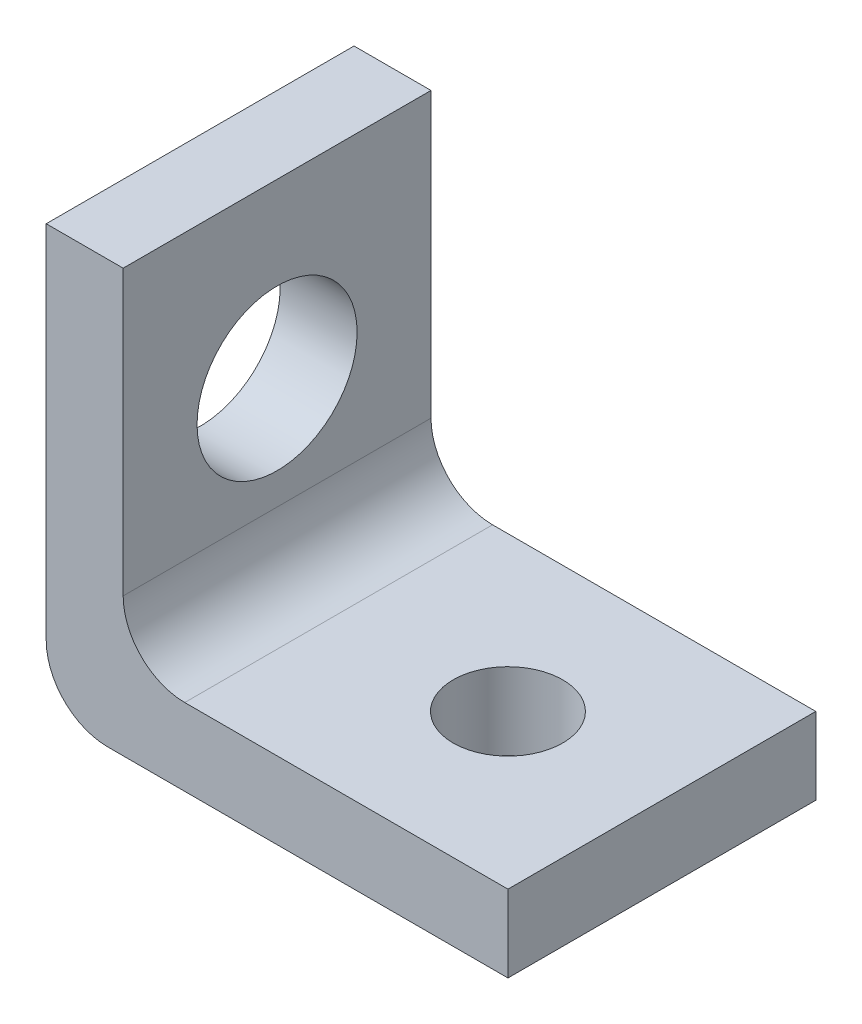
ISO-10303-21;
HEADER;
FILE_DESCRIPTION(('STEP AP214'),'2;1');
FILE_NAME('part.step','',(''),(''),'','','');
FILE_SCHEMA(('AUTOMOTIVE_DESIGN { 1 0 10303 214 1 1 1 1 }'));
ENDSEC;
DATA;
#1=APPLICATION_CONTEXT('core data for automotive mechanical design processes');
#2=APPLICATION_PROTOCOL_DEFINITION('international standard','automotive_design',2000,#1);
#3=PRODUCT_CONTEXT('',#1,'mechanical');
#4=PRODUCT('Part','Part','',(#3));
#5=PRODUCT_RELATED_PRODUCT_CATEGORY('part','',(#4));
#6=PRODUCT_DEFINITION_FORMATION('','',#4);
#7=PRODUCT_DEFINITION_CONTEXT('part definition',#1,'design');
#8=PRODUCT_DEFINITION('design','',#6,#7);
#9=PRODUCT_DEFINITION_SHAPE('','',#8);
#10=(LENGTH_UNIT() NAMED_UNIT(*) SI_UNIT(.MILLI.,.METRE.));
#11=(NAMED_UNIT(*) PLANE_ANGLE_UNIT() SI_UNIT($,.RADIAN.));
#12=(NAMED_UNIT(*) SI_UNIT($,.STERADIAN.) SOLID_ANGLE_UNIT());
#13=UNCERTAINTY_MEASURE_WITH_UNIT(LENGTH_MEASURE(1.E-05),#10,'distance_accuracy_value','');
#14=(GEOMETRIC_REPRESENTATION_CONTEXT(3) GLOBAL_UNCERTAINTY_ASSIGNED_CONTEXT((#13)) GLOBAL_UNIT_ASSIGNED_CONTEXT((#10,
#11,#12)) REPRESENTATION_CONTEXT('',''));
#15=CARTESIAN_POINT('',(0.,0.,0.));
#16=DIRECTION('',(0.,0.,1.));
#17=DIRECTION('',(1.,0.,0.));
#18=AXIS2_PLACEMENT_3D('',#15,#16,#17);
#19=CARTESIAN_POINT('',(0.,7.1247,6.35));
#20=DIRECTION('',(0.,-1.,0.));
#21=DIRECTION('',(1.,0.,0.));
#22=AXIS2_PLACEMENT_3D('',#19,#20,#21);
#23=PLANE('',#22);
#24=DIRECTION('',(-1.,0.,0.));
#25=VECTOR('',#24,1.);
#26=CARTESIAN_POINT('',(0.,7.1247,0.));
#27=LINE('',#26,#25);
#28=CARTESIAN_POINT('',(0.,7.1247,0.));
#29=VERTEX_POINT('',#28);
#30=CARTESIAN_POINT('',(-1.5875,7.1247,0.));
#31=VERTEX_POINT('',#30);
#32=EDGE_CURVE('E130',#29,#31,#27,.T.);
#33=ORIENTED_EDGE('',*,*,#32,.T.);
#34=DIRECTION('',(0.,0.,-1.));
#35=VECTOR('',#34,1.);
#36=CARTESIAN_POINT('',(-1.5875,7.1247,6.35));
#37=LINE('',#36,#35);
#38=CARTESIAN_POINT('',(-1.5875,7.1247,6.35));
#39=VERTEX_POINT('',#38);
#40=EDGE_CURVE('E11',#39,#31,#37,.T.);
#41=ORIENTED_EDGE('',*,*,#40,.F.);
#42=DIRECTION('',(-1.,0.,0.));
#43=VECTOR('',#42,1.);
#44=CARTESIAN_POINT('',(0.,7.1247,6.35));
#45=LINE('',#44,#43);
#46=CARTESIAN_POINT('',(0.,7.1247,6.35));
#47=VERTEX_POINT('',#46);
#48=EDGE_CURVE('E145',#47,#39,#45,.T.);
#49=ORIENTED_EDGE('',*,*,#48,.F.);
#50=DIRECTION('',(0.,0.,-1.));
#51=VECTOR('',#50,1.);
#52=CARTESIAN_POINT('',(0.,7.1247,6.35));
#53=LINE('',#52,#51);
#54=EDGE_CURVE('E126',#47,#29,#53,.T.);
#55=ORIENTED_EDGE('',*,*,#54,.T.);
#56=EDGE_LOOP('',(#33,#41,#49,#55));
#57=FACE_BOUND('',#56,.T.);
#58=ADVANCED_FACE('F34',(#57),#23,.F.);
#59=CARTESIAN_POINT('',(-1.5875,7.1247,6.35));
#60=DIRECTION('',(1.,0.,0.));
#61=DIRECTION('',(0.,1.,0.));
#62=AXIS2_PLACEMENT_3D('',#59,#60,#61);
#63=PLANE('',#62);
#64=CARTESIAN_POINT('',(-1.5875,3.5687,3.175));
#65=DIRECTION('',(1.,0.,0.));
#66=DIRECTION('',(0.,1.,0.));
#67=AXIS2_PLACEMENT_3D('',#64,#65,#66);
#68=CIRCLE('',#67,1.65099999999999);
#69=CARTESIAN_POINT('',(-1.5875,5.21969999999999,3.175));
#70=VERTEX_POINT('',#69);
#71=EDGE_CURVE('E134',#70,#70,#68,.T.);
#72=ORIENTED_EDGE('',*,*,#71,.T.);
#73=EDGE_LOOP('',(#72));
#74=FACE_BOUND('',#73,.T.);
#75=DIRECTION('',(0.,-1.,0.));
#76=VECTOR('',#75,1.);
#77=CARTESIAN_POINT('',(-1.5875,7.1247,0.));
#78=LINE('',#77,#76);
#79=CARTESIAN_POINT('',(-1.5875,-0.317499999999986,0.));
#80=VERTEX_POINT('',#79);
#81=EDGE_CURVE('E133',#31,#80,#78,.T.);
#82=ORIENTED_EDGE('',*,*,#81,.T.);
#83=DIRECTION('',(0.,0.,-1.));
#84=VECTOR('',#83,1.);
#85=CARTESIAN_POINT('',(-1.5875,-0.317499999999986,6.35));
#86=LINE('',#85,#84);
#87=CARTESIAN_POINT('',(-1.5875,-0.317499999999986,6.35));
#88=VERTEX_POINT('',#87);
#89=EDGE_CURVE('E42',#88,#80,#86,.T.);
#90=ORIENTED_EDGE('',*,*,#89,.F.);
#91=DIRECTION('',(0.,-1.,0.));
#92=VECTOR('',#91,1.);
#93=CARTESIAN_POINT('',(-1.5875,7.1247,6.35));
#94=LINE('',#93,#92);
#95=EDGE_CURVE('E93',#39,#88,#94,.T.);
#96=ORIENTED_EDGE('',*,*,#95,.F.);
#97=ORIENTED_EDGE('',*,*,#40,.T.);
#98=EDGE_LOOP('',(#82,#90,#96,#97));
#99=FACE_BOUND('',#98,.T.);
#100=ADVANCED_FACE('F202',(#74,#99),#63,.F.);
#101=CARTESIAN_POINT('',(-0.3175,-0.317499999999996,6.35));
#102=DIRECTION('',(0.,0.,-1.));
#103=DIRECTION('',(-1.,0.,0.));
#104=AXIS2_PLACEMENT_3D('',#101,#102,#103);
#105=CYLINDRICAL_SURFACE('',#104,1.27);
#106=CARTESIAN_POINT('',(-0.3175,-0.317499999999996,0.));
#107=DIRECTION('',(0.,0.,1.));
#108=DIRECTION('',(1.,0.,0.));
#109=AXIS2_PLACEMENT_3D('',#106,#107,#108);
#110=CIRCLE('',#109,1.27);
#111=CARTESIAN_POINT('',(-0.317499999999991,-1.5875,0.));
#112=VERTEX_POINT('',#111);
#113=EDGE_CURVE('E136',#80,#112,#110,.T.);
#114=ORIENTED_EDGE('',*,*,#113,.T.);
#115=DIRECTION('',(0.,0.,-1.));
#116=VECTOR('',#115,1.);
#117=CARTESIAN_POINT('',(-0.317499999999991,-1.5875,6.35));
#118=LINE('',#117,#116);
#119=CARTESIAN_POINT('',(-0.317499999999991,-1.5875,6.35));
#120=VERTEX_POINT('',#119);
#121=EDGE_CURVE('E152',#120,#112,#118,.T.);
#122=ORIENTED_EDGE('',*,*,#121,.F.);
#123=CARTESIAN_POINT('',(-0.3175,-0.317499999999996,6.35));
#124=DIRECTION('',(0.,0.,1.));
#125=DIRECTION('',(1.,0.,0.));
#126=AXIS2_PLACEMENT_3D('',#123,#124,#125);
#127=CIRCLE('',#126,1.27);
#128=EDGE_CURVE('E160',#88,#120,#127,.T.);
#129=ORIENTED_EDGE('',*,*,#128,.F.);
#130=ORIENTED_EDGE('',*,*,#89,.T.);
#131=EDGE_LOOP('',(#114,#122,#129,#130));
#132=FACE_BOUND('',#131,.T.);
#133=ADVANCED_FACE('F158',(#132),#105,.T.);
#134=CARTESIAN_POINT('',(-0.317499999999991,-1.5875,6.35));
#135=DIRECTION('',(0.,1.,0.));
#136=DIRECTION('',(-1.,0.,0.));
#137=AXIS2_PLACEMENT_3D('',#134,#135,#136);
#138=PLANE('',#137);
#139=CARTESIAN_POINT('',(4.7625,-1.5875,3.175));
#140=DIRECTION('',(0.,1.,0.));
#141=DIRECTION('',(0.,0.,1.));
#142=AXIS2_PLACEMENT_3D('',#139,#140,#141);
#143=CIRCLE('',#142,1.1303);
#144=CARTESIAN_POINT('',(4.7625,-1.5875,4.3053));
#145=VERTEX_POINT('',#144);
#146=EDGE_CURVE('E183',#145,#145,#143,.T.);
#147=ORIENTED_EDGE('',*,*,#146,.T.);
#148=EDGE_LOOP('',(#147));
#149=FACE_BOUND('',#148,.T.);
#150=DIRECTION('',(1.,0.,0.));
#151=VECTOR('',#150,1.);
#152=CARTESIAN_POINT('',(-0.317499999999991,-1.5875,0.));
#153=LINE('',#152,#151);
#154=CARTESIAN_POINT('',(7.9375,-1.5875,0.));
#155=VERTEX_POINT('',#154);
#156=EDGE_CURVE('E138',#112,#155,#153,.T.);
#157=ORIENTED_EDGE('',*,*,#156,.T.);
#158=DIRECTION('',(0.,0.,-1.));
#159=VECTOR('',#158,1.);
#160=CARTESIAN_POINT('',(7.9375,-1.5875,6.35));
#161=LINE('',#160,#159);
#162=CARTESIAN_POINT('',(7.9375,-1.5875,6.35));
#163=VERTEX_POINT('',#162);
#164=EDGE_CURVE('E149',#163,#155,#161,.T.);
#165=ORIENTED_EDGE('',*,*,#164,.F.);
#166=DIRECTION('',(1.,0.,0.));
#167=VECTOR('',#166,1.);
#168=CARTESIAN_POINT('',(-0.317499999999991,-1.5875,6.35));
#169=LINE('',#168,#167);
#170=EDGE_CURVE('E172',#120,#163,#169,.T.);
#171=ORIENTED_EDGE('',*,*,#170,.F.);
#172=ORIENTED_EDGE('',*,*,#121,.T.);
#173=EDGE_LOOP('',(#157,#165,#171,#172));
#174=FACE_BOUND('',#173,.T.);
#175=ADVANCED_FACE('F168',(#149,#174),#138,.F.);
#176=CARTESIAN_POINT('',(7.9375,-1.5875,6.35));
#177=DIRECTION('',(-1.,0.,0.));
#178=DIRECTION('',(0.,0.,1.));
#179=AXIS2_PLACEMENT_3D('',#176,#177,#178);
#180=PLANE('',#179);
#181=DIRECTION('',(0.,1.,0.));
#182=VECTOR('',#181,1.);
#183=CARTESIAN_POINT('',(7.9375,-1.5875,0.));
#184=LINE('',#183,#182);
#185=CARTESIAN_POINT('',(7.9375,0.,0.));
#186=VERTEX_POINT('',#185);
#187=EDGE_CURVE('E140',#155,#186,#184,.T.);
#188=ORIENTED_EDGE('',*,*,#187,.T.);
#189=DIRECTION('',(0.,0.,-1.));
#190=VECTOR('',#189,1.);
#191=CARTESIAN_POINT('',(7.9375,0.,6.35));
#192=LINE('',#191,#190);
#193=CARTESIAN_POINT('',(7.9375,0.,6.35));
#194=VERTEX_POINT('',#193);
#195=EDGE_CURVE('E121',#194,#186,#192,.T.);
#196=ORIENTED_EDGE('',*,*,#195,.F.);
#197=DIRECTION('',(0.,1.,0.));
#198=VECTOR('',#197,1.);
#199=CARTESIAN_POINT('',(7.9375,-1.5875,6.35));
#200=LINE('',#199,#198);
#201=EDGE_CURVE('E112',#163,#194,#200,.T.);
#202=ORIENTED_EDGE('',*,*,#201,.F.);
#203=ORIENTED_EDGE('',*,*,#164,.T.);
#204=EDGE_LOOP('',(#188,#196,#202,#203));
#205=FACE_BOUND('',#204,.T.);
#206=ADVANCED_FACE('F171',(#205),#180,.F.);
#207=CARTESIAN_POINT('',(7.9375,0.,6.35));
#208=DIRECTION('',(0.,-1.,0.));
#209=DIRECTION('',(1.,0.,0.));
#210=AXIS2_PLACEMENT_3D('',#207,#208,#209);
#211=PLANE('',#210);
#212=CARTESIAN_POINT('',(4.7625,0.,3.175));
#213=DIRECTION('',(0.,1.,0.));
#214=DIRECTION('',(0.,0.,1.));
#215=AXIS2_PLACEMENT_3D('',#212,#213,#214);
#216=CIRCLE('',#215,1.13029999999999);
#217=CARTESIAN_POINT('',(4.7625,0.,4.30529999999999));
#218=VERTEX_POINT('',#217);
#219=EDGE_CURVE('E186',#218,#218,#216,.T.);
#220=ORIENTED_EDGE('',*,*,#219,.F.);
#221=EDGE_LOOP('',(#220));
#222=FACE_BOUND('',#221,.T.);
#223=DIRECTION('',(-1.,0.,0.));
#224=VECTOR('',#223,1.);
#225=CARTESIAN_POINT('',(7.9375,0.,0.));
#226=LINE('',#225,#224);
#227=CARTESIAN_POINT('',(1.27000000000001,0.,0.));
#228=VERTEX_POINT('',#227);
#229=EDGE_CURVE('E120',#186,#228,#226,.T.);
#230=ORIENTED_EDGE('',*,*,#229,.T.);
#231=DIRECTION('',(0.,0.,-1.));
#232=VECTOR('',#231,1.);
#233=CARTESIAN_POINT('',(1.27000000000001,0.,6.35));
#234=LINE('',#233,#232);
#235=CARTESIAN_POINT('',(1.27000000000001,0.,6.35));
#236=VERTEX_POINT('',#235);
#237=EDGE_CURVE('E117',#236,#228,#234,.T.);
#238=ORIENTED_EDGE('',*,*,#237,.F.);
#239=DIRECTION('',(-1.,0.,0.));
#240=VECTOR('',#239,1.);
#241=CARTESIAN_POINT('',(7.9375,0.,6.35));
#242=LINE('',#241,#240);
#243=EDGE_CURVE('E106',#194,#236,#242,.T.);
#244=ORIENTED_EDGE('',*,*,#243,.F.);
#245=ORIENTED_EDGE('',*,*,#195,.T.);
#246=EDGE_LOOP('',(#230,#238,#244,#245));
#247=FACE_BOUND('',#246,.T.);
#248=ADVANCED_FACE('F118',(#222,#247),#211,.F.);
#249=CARTESIAN_POINT('',(1.27,1.27,6.35));
#250=DIRECTION('',(0.,0.,-1.));
#251=DIRECTION('',(-1.,0.,0.));
#252=AXIS2_PLACEMENT_3D('',#249,#250,#251);
#253=CYLINDRICAL_SURFACE('',#252,1.27);
#254=CARTESIAN_POINT('',(1.27,1.27,0.));
#255=DIRECTION('',(0.,0.,-1.));
#256=DIRECTION('',(1.,0.,0.));
#257=AXIS2_PLACEMENT_3D('',#254,#255,#256);
#258=CIRCLE('',#257,1.27);
#259=CARTESIAN_POINT('',(0.,1.27000000000001,0.));
#260=VERTEX_POINT('',#259);
#261=EDGE_CURVE('E79',#228,#260,#258,.T.);
#262=ORIENTED_EDGE('',*,*,#261,.T.);
#263=DIRECTION('',(0.,0.,-1.));
#264=VECTOR('',#263,1.);
#265=CARTESIAN_POINT('',(0.,1.27000000000001,6.35));
#266=LINE('',#265,#264);
#267=CARTESIAN_POINT('',(0.,1.27000000000001,6.35));
#268=VERTEX_POINT('',#267);
#269=EDGE_CURVE('E122',#268,#260,#266,.T.);
#270=ORIENTED_EDGE('',*,*,#269,.F.);
#271=CARTESIAN_POINT('',(1.27,1.27,6.35));
#272=DIRECTION('',(0.,0.,-1.));
#273=DIRECTION('',(1.,0.,0.));
#274=AXIS2_PLACEMENT_3D('',#271,#272,#273);
#275=CIRCLE('',#274,1.27);
#276=EDGE_CURVE('E110',#236,#268,#275,.T.);
#277=ORIENTED_EDGE('',*,*,#276,.F.);
#278=ORIENTED_EDGE('',*,*,#237,.T.);
#279=EDGE_LOOP('',(#262,#270,#277,#278));
#280=FACE_BOUND('',#279,.T.);
#281=ADVANCED_FACE('F124',(#280),#253,.F.);
#282=CARTESIAN_POINT('',(0.,1.27000000000001,6.35));
#283=DIRECTION('',(-1.,0.,0.));
#284=DIRECTION('',(0.,-1.,0.));
#285=AXIS2_PLACEMENT_3D('',#282,#283,#284);
#286=PLANE('',#285);
#287=CARTESIAN_POINT('',(0.,3.5687,3.175));
#288=DIRECTION('',(1.,0.,0.));
#289=DIRECTION('',(0.,0.,-1.));
#290=AXIS2_PLACEMENT_3D('',#287,#288,#289);
#291=CIRCLE('',#290,1.65099999999999);
#292=CARTESIAN_POINT('',(0.,3.5687,1.52400000000001));
#293=VERTEX_POINT('',#292);
#294=EDGE_CURVE('E180',#293,#293,#291,.T.);
#295=ORIENTED_EDGE('',*,*,#294,.F.);
#296=EDGE_LOOP('',(#295));
#297=FACE_BOUND('',#296,.T.);
#298=DIRECTION('',(0.,1.,0.));
#299=VECTOR('',#298,1.);
#300=CARTESIAN_POINT('',(0.,1.27000000000001,0.));
#301=LINE('',#300,#299);
#302=EDGE_CURVE('E85',#260,#29,#301,.T.);
#303=ORIENTED_EDGE('',*,*,#302,.T.);
#304=ORIENTED_EDGE('',*,*,#54,.F.);
#305=DIRECTION('',(0.,1.,0.));
#306=VECTOR('',#305,1.);
#307=CARTESIAN_POINT('',(0.,1.27000000000001,6.35));
#308=LINE('',#307,#306);
#309=EDGE_CURVE('E50',#268,#47,#308,.T.);
#310=ORIENTED_EDGE('',*,*,#309,.F.);
#311=ORIENTED_EDGE('',*,*,#269,.T.);
#312=EDGE_LOOP('',(#303,#304,#310,#311));
#313=FACE_BOUND('',#312,.T.);
#314=ADVANCED_FACE('F198',(#297,#313),#286,.F.);
#315=CARTESIAN_POINT('',(-0.3175,-0.317499999999996,6.35));
#316=DIRECTION('',(0.,0.,1.));
#317=DIRECTION('',(1.,0.,0.));
#318=AXIS2_PLACEMENT_3D('',#315,#316,#317);
#319=PLANE('',#318);
#320=ORIENTED_EDGE('',*,*,#48,.T.);
#321=ORIENTED_EDGE('',*,*,#95,.T.);
#322=ORIENTED_EDGE('',*,*,#128,.T.);
#323=ORIENTED_EDGE('',*,*,#170,.T.);
#324=ORIENTED_EDGE('',*,*,#201,.T.);
#325=ORIENTED_EDGE('',*,*,#243,.T.);
#326=ORIENTED_EDGE('',*,*,#276,.T.);
#327=ORIENTED_EDGE('',*,*,#309,.T.);
#328=EDGE_LOOP('',(#320,#321,#322,#323,#324,#325,#326,#327));
#329=FACE_BOUND('',#328,.T.);
#330=ADVANCED_FACE('F108',(#329),#319,.T.);
#331=CARTESIAN_POINT('',(-0.3175,-0.317499999999996,0.));
#332=DIRECTION('',(0.,0.,1.));
#333=DIRECTION('',(1.,0.,0.));
#334=AXIS2_PLACEMENT_3D('',#331,#332,#333);
#335=PLANE('',#334);
#336=ORIENTED_EDGE('',*,*,#32,.F.);
#337=ORIENTED_EDGE('',*,*,#302,.F.);
#338=ORIENTED_EDGE('',*,*,#261,.F.);
#339=ORIENTED_EDGE('',*,*,#229,.F.);
#340=ORIENTED_EDGE('',*,*,#187,.F.);
#341=ORIENTED_EDGE('',*,*,#156,.F.);
#342=ORIENTED_EDGE('',*,*,#113,.F.);
#343=ORIENTED_EDGE('',*,*,#81,.F.);
#344=EDGE_LOOP('',(#336,#337,#338,#339,#340,#341,#342,#343));
#345=FACE_BOUND('',#344,.T.);
#346=ADVANCED_FACE('F164',(#345),#335,.F.);
#347=CARTESIAN_POINT('',(0.,3.5687,3.175));
#348=DIRECTION('',(1.,0.,0.));
#349=DIRECTION('',(0.,0.,-1.));
#350=AXIS2_PLACEMENT_3D('',#347,#348,#349);
#351=CYLINDRICAL_SURFACE('',#350,1.65099999999999);
#352=ORIENTED_EDGE('',*,*,#294,.T.);
#353=EDGE_LOOP('',(#352));
#354=FACE_BOUND('',#353,.T.);
#355=ORIENTED_EDGE('',*,*,#71,.F.);
#356=EDGE_LOOP('',(#355));
#357=FACE_BOUND('',#356,.T.);
#358=ADVANCED_FACE('F220',(#354,#357),#351,.F.);
#359=CARTESIAN_POINT('',(4.7625,0.,3.175));
#360=DIRECTION('',(0.,1.,0.));
#361=DIRECTION('',(0.,0.,1.));
#362=AXIS2_PLACEMENT_3D('',#359,#360,#361);
#363=CYLINDRICAL_SURFACE('',#362,1.13029999999999);
#364=ORIENTED_EDGE('',*,*,#146,.F.);
#365=EDGE_LOOP('',(#364));
#366=FACE_BOUND('',#365,.T.);
#367=ORIENTED_EDGE('',*,*,#219,.T.);
#368=EDGE_LOOP('',(#367));
#369=FACE_BOUND('',#368,.T.);
#370=ADVANCED_FACE('F190',(#366,#369),#363,.F.);
#371=CLOSED_SHELL('',(#58,#100,#133,#175,#206,#248,#281,#314,#330,#346,#358,#370));
#372=MANIFOLD_SOLID_BREP('B2',#371);
#373=ADVANCED_BREP_SHAPE_REPRESENTATION('',(#18,#372),#14);
#374=SHAPE_DEFINITION_REPRESENTATION(#9,#373);
ENDSEC;
END-ISO-10303-21;
